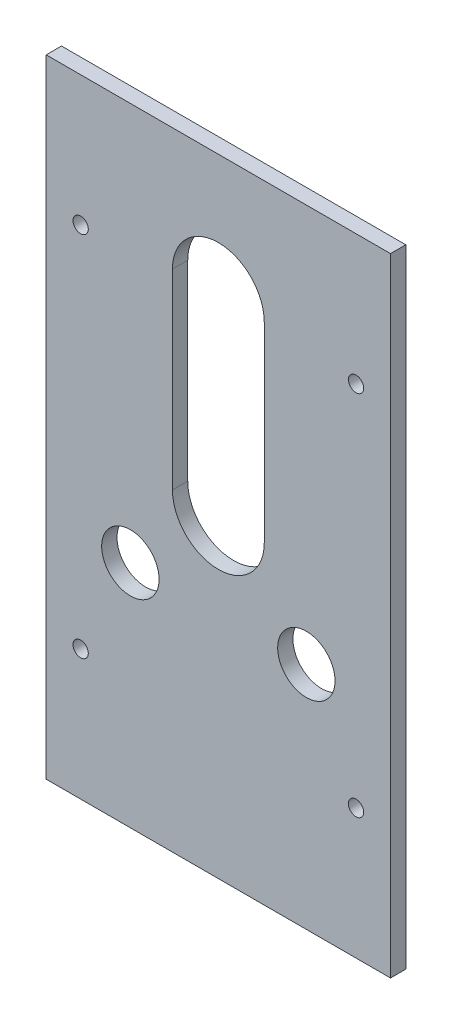
ISO-10303-21;
HEADER;
FILE_DESCRIPTION(('STEP AP214'),'2;1');
FILE_NAME('part.step','',(''),(''),'','','');
FILE_SCHEMA(('AUTOMOTIVE_DESIGN { 1 0 10303 214 1 1 1 1 }'));
ENDSEC;
DATA;
#1=APPLICATION_CONTEXT('core data for automotive mechanical design processes');
#2=APPLICATION_PROTOCOL_DEFINITION('international standard','automotive_design',2000,#1);
#3=PRODUCT_CONTEXT('',#1,'mechanical');
#4=PRODUCT('Part','Part','',(#3));
#5=PRODUCT_RELATED_PRODUCT_CATEGORY('part','',(#4));
#6=PRODUCT_DEFINITION_FORMATION('','',#4);
#7=PRODUCT_DEFINITION_CONTEXT('part definition',#1,'design');
#8=PRODUCT_DEFINITION('design','',#6,#7);
#9=PRODUCT_DEFINITION_SHAPE('','',#8);
#10=(LENGTH_UNIT() NAMED_UNIT(*) SI_UNIT(.MILLI.,.METRE.));
#11=(NAMED_UNIT(*) PLANE_ANGLE_UNIT() SI_UNIT($,.RADIAN.));
#12=(NAMED_UNIT(*) SI_UNIT($,.STERADIAN.) SOLID_ANGLE_UNIT());
#13=UNCERTAINTY_MEASURE_WITH_UNIT(LENGTH_MEASURE(1.E-05),#10,'distance_accuracy_value','');
#14=(GEOMETRIC_REPRESENTATION_CONTEXT(3) GLOBAL_UNCERTAINTY_ASSIGNED_CONTEXT((#13)) GLOBAL_UNIT_ASSIGNED_CONTEXT((#10,
#11,#12)) REPRESENTATION_CONTEXT('',''));
#15=CARTESIAN_POINT('',(0.,0.,0.));
#16=DIRECTION('',(0.,0.,1.));
#17=DIRECTION('',(1.,0.,0.));
#18=AXIS2_PLACEMENT_3D('',#15,#16,#17);
#19=CARTESIAN_POINT('',(0.,0.,4.));
#20=DIRECTION('',(0.,0.,-1.));
#21=DIRECTION('',(-1.,0.,0.));
#22=AXIS2_PLACEMENT_3D('',#19,#20,#21);
#23=PLANE('',#22);
#24=CARTESIAN_POINT('',(36.,48.,4.));
#25=DIRECTION('',(0.,0.,1.));
#26=DIRECTION('',(-1.,0.,0.));
#27=AXIS2_PLACEMENT_3D('',#24,#25,#26);
#28=CIRCLE('',#27,2.);
#29=CARTESIAN_POINT('',(34.,48.,4.));
#30=VERTEX_POINT('',#29);
#31=EDGE_CURVE('E139',#30,#30,#28,.T.);
#32=ORIENTED_EDGE('',*,*,#31,.F.);
#33=EDGE_LOOP('',(#32));
#34=FACE_BOUND('',#33,.T.);
#35=CARTESIAN_POINT('',(36.,-48.,4.));
#36=DIRECTION('',(0.,0.,1.));
#37=DIRECTION('',(-1.,0.,0.));
#38=AXIS2_PLACEMENT_3D('',#35,#36,#37);
#39=CIRCLE('',#38,2.);
#40=CARTESIAN_POINT('',(34.,-48.,4.));
#41=VERTEX_POINT('',#40);
#42=EDGE_CURVE('E145',#41,#41,#39,.T.);
#43=ORIENTED_EDGE('',*,*,#42,.F.);
#44=EDGE_LOOP('',(#43));
#45=FACE_BOUND('',#44,.T.);
#46=CARTESIAN_POINT('',(-36.,-48.,4.));
#47=DIRECTION('',(0.,0.,1.));
#48=DIRECTION('',(1.,0.,0.));
#49=AXIS2_PLACEMENT_3D('',#46,#47,#48);
#50=CIRCLE('',#49,2.);
#51=CARTESIAN_POINT('',(-34.,-48.,4.));
#52=VERTEX_POINT('',#51);
#53=EDGE_CURVE('E151',#52,#52,#50,.T.);
#54=ORIENTED_EDGE('',*,*,#53,.F.);
#55=EDGE_LOOP('',(#54));
#56=FACE_BOUND('',#55,.T.);
#57=CARTESIAN_POINT('',(-36.,48.,4.));
#58=DIRECTION('',(0.,0.,1.));
#59=DIRECTION('',(1.,0.,0.));
#60=AXIS2_PLACEMENT_3D('',#57,#58,#59);
#61=CIRCLE('',#60,2.);
#62=CARTESIAN_POINT('',(-34.,48.,4.));
#63=VERTEX_POINT('',#62);
#64=EDGE_CURVE('E157',#63,#63,#61,.T.);
#65=ORIENTED_EDGE('',*,*,#64,.F.);
#66=EDGE_LOOP('',(#65));
#67=FACE_BOUND('',#66,.T.);
#68=DIRECTION('',(0.,1.,0.));
#69=VECTOR('',#68,1.);
#70=CARTESIAN_POINT('',(45.,-82.,4.));
#71=LINE('',#70,#69);
#72=CARTESIAN_POINT('',(45.,-82.,4.));
#73=VERTEX_POINT('',#72);
#74=CARTESIAN_POINT('',(45.,82.,4.));
#75=VERTEX_POINT('',#74);
#76=EDGE_CURVE('E163',#73,#75,#71,.T.);
#77=ORIENTED_EDGE('',*,*,#76,.T.);
#78=DIRECTION('',(-1.,0.,0.));
#79=VECTOR('',#78,1.);
#80=CARTESIAN_POINT('',(-45.,82.,4.));
#81=LINE('',#80,#79);
#82=CARTESIAN_POINT('',(-45.,82.,4.));
#83=VERTEX_POINT('',#82);
#84=EDGE_CURVE('E166',#75,#83,#81,.T.);
#85=ORIENTED_EDGE('',*,*,#84,.T.);
#86=DIRECTION('',(0.,-1.,0.));
#87=VECTOR('',#86,1.);
#88=CARTESIAN_POINT('',(-45.,-82.,4.));
#89=LINE('',#88,#87);
#90=CARTESIAN_POINT('',(-45.,-82.,4.));
#91=VERTEX_POINT('',#90);
#92=EDGE_CURVE('E169',#83,#91,#89,.T.);
#93=ORIENTED_EDGE('',*,*,#92,.T.);
#94=DIRECTION('',(1.,0.,0.));
#95=VECTOR('',#94,1.);
#96=CARTESIAN_POINT('',(-45.,-82.,4.));
#97=LINE('',#96,#95);
#98=EDGE_CURVE('E171',#91,#73,#97,.T.);
#99=ORIENTED_EDGE('',*,*,#98,.T.);
#100=EDGE_LOOP('',(#77,#85,#93,#99));
#101=FACE_BOUND('',#100,.T.);
#102=CARTESIAN_POINT('',(0.,0.,4.));
#103=DIRECTION('',(0.,0.,1.));
#104=DIRECTION('',(1.,0.,0.));
#105=AXIS2_PLACEMENT_3D('',#102,#103,#104);
#106=CIRCLE('',#105,12.);
#107=CARTESIAN_POINT('',(-12.,0.,4.));
#108=VERTEX_POINT('',#107);
#109=CARTESIAN_POINT('',(12.,0.,4.));
#110=VERTEX_POINT('',#109);
#111=EDGE_CURVE('E100',#108,#110,#106,.T.);
#112=ORIENTED_EDGE('',*,*,#111,.F.);
#113=DIRECTION('',(0.,-1.,0.));
#114=VECTOR('',#113,1.);
#115=CARTESIAN_POINT('',(-12.,0.,4.));
#116=LINE('',#115,#114);
#117=CARTESIAN_POINT('',(-12.,50.,4.));
#118=VERTEX_POINT('',#117);
#119=EDGE_CURVE('E123',#118,#108,#116,.T.);
#120=ORIENTED_EDGE('',*,*,#119,.F.);
#121=CARTESIAN_POINT('',(0.,50.,4.));
#122=DIRECTION('',(0.,0.,1.));
#123=DIRECTION('',(1.,0.,0.));
#124=AXIS2_PLACEMENT_3D('',#121,#122,#123);
#125=CIRCLE('',#124,12.);
#126=CARTESIAN_POINT('',(12.,50.,4.));
#127=VERTEX_POINT('',#126);
#128=EDGE_CURVE('E121',#127,#118,#125,.T.);
#129=ORIENTED_EDGE('',*,*,#128,.F.);
#130=DIRECTION('',(0.,1.,0.));
#131=VECTOR('',#130,1.);
#132=CARTESIAN_POINT('',(12.,0.,4.));
#133=LINE('',#132,#131);
#134=EDGE_CURVE('E108',#110,#127,#133,.T.);
#135=ORIENTED_EDGE('',*,*,#134,.F.);
#136=EDGE_LOOP('',(#112,#120,#129,#135));
#137=FACE_BOUND('',#136,.T.);
#138=CARTESIAN_POINT('',(-23.,-22.,4.));
#139=DIRECTION('',(0.,0.,1.));
#140=DIRECTION('',(1.,0.,0.));
#141=AXIS2_PLACEMENT_3D('',#138,#139,#140);
#142=CIRCLE('',#141,7.5);
#143=CARTESIAN_POINT('',(-15.5,-22.,4.));
#144=VERTEX_POINT('',#143);
#145=EDGE_CURVE('E129',#144,#144,#142,.T.);
#146=ORIENTED_EDGE('',*,*,#145,.F.);
#147=EDGE_LOOP('',(#146));
#148=FACE_BOUND('',#147,.T.);
#149=CARTESIAN_POINT('',(23.,-22.,4.));
#150=DIRECTION('',(0.,0.,1.));
#151=DIRECTION('',(-1.,0.,0.));
#152=AXIS2_PLACEMENT_3D('',#149,#150,#151);
#153=CIRCLE('',#152,7.5);
#154=CARTESIAN_POINT('',(15.5,-22.,4.));
#155=VERTEX_POINT('',#154);
#156=EDGE_CURVE('E277',#155,#155,#153,.T.);
#157=ORIENTED_EDGE('',*,*,#156,.F.);
#158=EDGE_LOOP('',(#157));
#159=FACE_BOUND('',#158,.T.);
#160=ADVANCED_FACE('F35',(#34,#45,#56,#67,#101,#137,#148,#159),#23,.F.);
#161=CARTESIAN_POINT('',(0.,0.,0.));
#162=DIRECTION('',(0.,0.,-1.));
#163=DIRECTION('',(-1.,0.,0.));
#164=AXIS2_PLACEMENT_3D('',#161,#162,#163);
#165=PLANE('',#164);
#166=CARTESIAN_POINT('',(-23.,-22.,0.));
#167=DIRECTION('',(0.,0.,1.));
#168=DIRECTION('',(1.,0.,0.));
#169=AXIS2_PLACEMENT_3D('',#166,#167,#168);
#170=CIRCLE('',#169,7.5);
#171=CARTESIAN_POINT('',(-15.5,-22.,0.));
#172=VERTEX_POINT('',#171);
#173=EDGE_CURVE('E283',#172,#172,#170,.T.);
#174=ORIENTED_EDGE('',*,*,#173,.T.);
#175=EDGE_LOOP('',(#174));
#176=FACE_BOUND('',#175,.T.);
#177=CARTESIAN_POINT('',(36.,-48.,0.));
#178=DIRECTION('',(0.,0.,1.));
#179=DIRECTION('',(-1.,0.,0.));
#180=AXIS2_PLACEMENT_3D('',#177,#178,#179);
#181=CIRCLE('',#180,2.);
#182=CARTESIAN_POINT('',(34.,-48.,0.));
#183=VERTEX_POINT('',#182);
#184=EDGE_CURVE('E142',#183,#183,#181,.T.);
#185=ORIENTED_EDGE('',*,*,#184,.T.);
#186=EDGE_LOOP('',(#185));
#187=FACE_BOUND('',#186,.T.);
#188=CARTESIAN_POINT('',(-36.,48.,0.));
#189=DIRECTION('',(0.,0.,1.));
#190=DIRECTION('',(1.,0.,0.));
#191=AXIS2_PLACEMENT_3D('',#188,#189,#190);
#192=CIRCLE('',#191,2.);
#193=CARTESIAN_POINT('',(-34.,48.,0.));
#194=VERTEX_POINT('',#193);
#195=EDGE_CURVE('E154',#194,#194,#192,.T.);
#196=ORIENTED_EDGE('',*,*,#195,.T.);
#197=EDGE_LOOP('',(#196));
#198=FACE_BOUND('',#197,.T.);
#199=DIRECTION('',(0.,1.,0.));
#200=VECTOR('',#199,1.);
#201=CARTESIAN_POINT('',(45.,-82.,0.));
#202=LINE('',#201,#200);
#203=CARTESIAN_POINT('',(45.,-82.,0.));
#204=VERTEX_POINT('',#203);
#205=CARTESIAN_POINT('',(45.,82.,0.));
#206=VERTEX_POINT('',#205);
#207=EDGE_CURVE('E160',#204,#206,#202,.T.);
#208=ORIENTED_EDGE('',*,*,#207,.F.);
#209=DIRECTION('',(1.,0.,0.));
#210=VECTOR('',#209,1.);
#211=CARTESIAN_POINT('',(-45.,-82.,0.));
#212=LINE('',#211,#210);
#213=CARTESIAN_POINT('',(-45.,-82.,0.));
#214=VERTEX_POINT('',#213);
#215=EDGE_CURVE('E167',#214,#204,#212,.T.);
#216=ORIENTED_EDGE('',*,*,#215,.F.);
#217=DIRECTION('',(0.,-1.,0.));
#218=VECTOR('',#217,1.);
#219=CARTESIAN_POINT('',(-45.,-82.,0.));
#220=LINE('',#219,#218);
#221=CARTESIAN_POINT('',(-45.,82.,0.));
#222=VERTEX_POINT('',#221);
#223=EDGE_CURVE('E178',#222,#214,#220,.T.);
#224=ORIENTED_EDGE('',*,*,#223,.F.);
#225=DIRECTION('',(-1.,0.,0.));
#226=VECTOR('',#225,1.);
#227=CARTESIAN_POINT('',(-45.,82.,0.));
#228=LINE('',#227,#226);
#229=EDGE_CURVE('E176',#206,#222,#228,.T.);
#230=ORIENTED_EDGE('',*,*,#229,.F.);
#231=EDGE_LOOP('',(#208,#216,#224,#230));
#232=FACE_BOUND('',#231,.T.);
#233=CARTESIAN_POINT('',(-36.,-48.,0.));
#234=DIRECTION('',(0.,0.,1.));
#235=DIRECTION('',(1.,0.,0.));
#236=AXIS2_PLACEMENT_3D('',#233,#234,#235);
#237=CIRCLE('',#236,2.);
#238=CARTESIAN_POINT('',(-34.,-48.,0.));
#239=VERTEX_POINT('',#238);
#240=EDGE_CURVE('E148',#239,#239,#237,.T.);
#241=ORIENTED_EDGE('',*,*,#240,.T.);
#242=EDGE_LOOP('',(#241));
#243=FACE_BOUND('',#242,.T.);
#244=CARTESIAN_POINT('',(36.,48.,0.));
#245=DIRECTION('',(0.,0.,1.));
#246=DIRECTION('',(-1.,0.,0.));
#247=AXIS2_PLACEMENT_3D('',#244,#245,#246);
#248=CIRCLE('',#247,2.);
#249=CARTESIAN_POINT('',(34.,48.,0.));
#250=VERTEX_POINT('',#249);
#251=EDGE_CURVE('E116',#250,#250,#248,.T.);
#252=ORIENTED_EDGE('',*,*,#251,.T.);
#253=EDGE_LOOP('',(#252));
#254=FACE_BOUND('',#253,.T.);
#255=DIRECTION('',(0.,-1.,0.));
#256=VECTOR('',#255,1.);
#257=CARTESIAN_POINT('',(-12.,0.,0.));
#258=LINE('',#257,#256);
#259=CARTESIAN_POINT('',(-12.,50.,0.));
#260=VERTEX_POINT('',#259);
#261=CARTESIAN_POINT('',(-12.,0.,0.));
#262=VERTEX_POINT('',#261);
#263=EDGE_CURVE('E109',#260,#262,#258,.T.);
#264=ORIENTED_EDGE('',*,*,#263,.T.);
#265=CARTESIAN_POINT('',(0.,0.,0.));
#266=DIRECTION('',(0.,0.,1.));
#267=DIRECTION('',(1.,0.,0.));
#268=AXIS2_PLACEMENT_3D('',#265,#266,#267);
#269=CIRCLE('',#268,12.);
#270=CARTESIAN_POINT('',(12.,0.,0.));
#271=VERTEX_POINT('',#270);
#272=EDGE_CURVE('E58',#262,#271,#269,.T.);
#273=ORIENTED_EDGE('',*,*,#272,.T.);
#274=DIRECTION('',(0.,1.,0.));
#275=VECTOR('',#274,1.);
#276=CARTESIAN_POINT('',(12.,0.,0.));
#277=LINE('',#276,#275);
#278=CARTESIAN_POINT('',(12.,50.,0.));
#279=VERTEX_POINT('',#278);
#280=EDGE_CURVE('E115',#271,#279,#277,.T.);
#281=ORIENTED_EDGE('',*,*,#280,.T.);
#282=CARTESIAN_POINT('',(0.,50.,0.));
#283=DIRECTION('',(0.,0.,1.));
#284=DIRECTION('',(1.,0.,0.));
#285=AXIS2_PLACEMENT_3D('',#282,#283,#284);
#286=CIRCLE('',#285,12.);
#287=EDGE_CURVE('E131',#279,#260,#286,.T.);
#288=ORIENTED_EDGE('',*,*,#287,.T.);
#289=EDGE_LOOP('',(#264,#273,#281,#288));
#290=FACE_BOUND('',#289,.T.);
#291=CARTESIAN_POINT('',(23.,-22.,0.));
#292=DIRECTION('',(0.,0.,1.));
#293=DIRECTION('',(-1.,0.,0.));
#294=AXIS2_PLACEMENT_3D('',#291,#292,#293);
#295=CIRCLE('',#294,7.5);
#296=CARTESIAN_POINT('',(15.5,-22.,0.));
#297=VERTEX_POINT('',#296);
#298=EDGE_CURVE('E280',#297,#297,#295,.T.);
#299=ORIENTED_EDGE('',*,*,#298,.T.);
#300=EDGE_LOOP('',(#299));
#301=FACE_BOUND('',#300,.T.);
#302=ADVANCED_FACE('F196',(#176,#187,#198,#232,#243,#254,#290,#301),#165,.T.);
#303=CARTESIAN_POINT('',(45.,-82.,4.));
#304=DIRECTION('',(-1.,0.,0.));
#305=DIRECTION('',(0.,0.,1.));
#306=AXIS2_PLACEMENT_3D('',#303,#304,#305);
#307=PLANE('',#306);
#308=ORIENTED_EDGE('',*,*,#207,.T.);
#309=DIRECTION('',(0.,0.,-1.));
#310=VECTOR('',#309,1.);
#311=CARTESIAN_POINT('',(45.,82.,4.));
#312=LINE('',#311,#310);
#313=EDGE_CURVE('E11',#75,#206,#312,.T.);
#314=ORIENTED_EDGE('',*,*,#313,.F.);
#315=ORIENTED_EDGE('',*,*,#76,.F.);
#316=DIRECTION('',(0.,0.,-1.));
#317=VECTOR('',#316,1.);
#318=CARTESIAN_POINT('',(45.,-82.,4.));
#319=LINE('',#318,#317);
#320=EDGE_CURVE('E173',#73,#204,#319,.T.);
#321=ORIENTED_EDGE('',*,*,#320,.T.);
#322=EDGE_LOOP('',(#308,#314,#315,#321));
#323=FACE_BOUND('',#322,.T.);
#324=ADVANCED_FACE('F37',(#323),#307,.F.);
#325=CARTESIAN_POINT('',(-45.,82.,4.));
#326=DIRECTION('',(0.,-1.,0.));
#327=DIRECTION('',(0.,0.,-1.));
#328=AXIS2_PLACEMENT_3D('',#325,#326,#327);
#329=PLANE('',#328);
#330=ORIENTED_EDGE('',*,*,#229,.T.);
#331=DIRECTION('',(0.,0.,-1.));
#332=VECTOR('',#331,1.);
#333=CARTESIAN_POINT('',(-45.,82.,4.));
#334=LINE('',#333,#332);
#335=EDGE_CURVE('E43',#83,#222,#334,.T.);
#336=ORIENTED_EDGE('',*,*,#335,.F.);
#337=ORIENTED_EDGE('',*,*,#84,.F.);
#338=ORIENTED_EDGE('',*,*,#313,.T.);
#339=EDGE_LOOP('',(#330,#336,#337,#338));
#340=FACE_BOUND('',#339,.T.);
#341=ADVANCED_FACE('F206',(#340),#329,.F.);
#342=CARTESIAN_POINT('',(-45.,-82.,4.));
#343=DIRECTION('',(1.,0.,0.));
#344=DIRECTION('',(0.,1.,0.));
#345=AXIS2_PLACEMENT_3D('',#342,#343,#344);
#346=PLANE('',#345);
#347=ORIENTED_EDGE('',*,*,#223,.T.);
#348=DIRECTION('',(0.,0.,-1.));
#349=VECTOR('',#348,1.);
#350=CARTESIAN_POINT('',(-45.,-82.,4.));
#351=LINE('',#350,#349);
#352=EDGE_CURVE('E183',#91,#214,#351,.T.);
#353=ORIENTED_EDGE('',*,*,#352,.F.);
#354=ORIENTED_EDGE('',*,*,#92,.F.);
#355=ORIENTED_EDGE('',*,*,#335,.T.);
#356=EDGE_LOOP('',(#347,#353,#354,#355));
#357=FACE_BOUND('',#356,.T.);
#358=ADVANCED_FACE('F190',(#357),#346,.F.);
#359=CARTESIAN_POINT('',(-45.,-82.,4.));
#360=DIRECTION('',(0.,1.,0.));
#361=DIRECTION('',(0.,0.,1.));
#362=AXIS2_PLACEMENT_3D('',#359,#360,#361);
#363=PLANE('',#362);
#364=ORIENTED_EDGE('',*,*,#215,.T.);
#365=ORIENTED_EDGE('',*,*,#320,.F.);
#366=ORIENTED_EDGE('',*,*,#98,.F.);
#367=ORIENTED_EDGE('',*,*,#352,.T.);
#368=EDGE_LOOP('',(#364,#365,#366,#367));
#369=FACE_BOUND('',#368,.T.);
#370=ADVANCED_FACE('F200',(#369),#363,.F.);
#371=CARTESIAN_POINT('',(-36.,48.,4.));
#372=DIRECTION('',(0.,0.,-1.));
#373=DIRECTION('',(-1.,0.,0.));
#374=AXIS2_PLACEMENT_3D('',#371,#372,#373);
#375=CYLINDRICAL_SURFACE('',#374,2.);
#376=ORIENTED_EDGE('',*,*,#64,.T.);
#377=EDGE_LOOP('',(#376));
#378=FACE_BOUND('',#377,.T.);
#379=ORIENTED_EDGE('',*,*,#195,.F.);
#380=EDGE_LOOP('',(#379));
#381=FACE_BOUND('',#380,.T.);
#382=ADVANCED_FACE('F224',(#378,#381),#375,.F.);
#383=CARTESIAN_POINT('',(-36.,-48.,4.));
#384=DIRECTION('',(0.,0.,-1.));
#385=DIRECTION('',(-1.,0.,0.));
#386=AXIS2_PLACEMENT_3D('',#383,#384,#385);
#387=CYLINDRICAL_SURFACE('',#386,2.);
#388=ORIENTED_EDGE('',*,*,#53,.T.);
#389=EDGE_LOOP('',(#388));
#390=FACE_BOUND('',#389,.T.);
#391=ORIENTED_EDGE('',*,*,#240,.F.);
#392=EDGE_LOOP('',(#391));
#393=FACE_BOUND('',#392,.T.);
#394=ADVANCED_FACE('F231',(#390,#393),#387,.F.);
#395=CARTESIAN_POINT('',(36.,-48.,4.));
#396=DIRECTION('',(0.,0.,-1.));
#397=DIRECTION('',(-1.,0.,0.));
#398=AXIS2_PLACEMENT_3D('',#395,#396,#397);
#399=CYLINDRICAL_SURFACE('',#398,2.);
#400=ORIENTED_EDGE('',*,*,#42,.T.);
#401=EDGE_LOOP('',(#400));
#402=FACE_BOUND('',#401,.T.);
#403=ORIENTED_EDGE('',*,*,#184,.F.);
#404=EDGE_LOOP('',(#403));
#405=FACE_BOUND('',#404,.T.);
#406=ADVANCED_FACE('F236',(#402,#405),#399,.F.);
#407=CARTESIAN_POINT('',(36.,48.,4.));
#408=DIRECTION('',(0.,0.,-1.));
#409=DIRECTION('',(-1.,0.,0.));
#410=AXIS2_PLACEMENT_3D('',#407,#408,#409);
#411=CYLINDRICAL_SURFACE('',#410,2.);
#412=ORIENTED_EDGE('',*,*,#31,.T.);
#413=EDGE_LOOP('',(#412));
#414=FACE_BOUND('',#413,.T.);
#415=ORIENTED_EDGE('',*,*,#251,.F.);
#416=EDGE_LOOP('',(#415));
#417=FACE_BOUND('',#416,.T.);
#418=ADVANCED_FACE('F246',(#414,#417),#411,.F.);
#419=CARTESIAN_POINT('',(0.,0.,4.));
#420=DIRECTION('',(0.,0.,-1.));
#421=DIRECTION('',(-1.,0.,0.));
#422=AXIS2_PLACEMENT_3D('',#419,#420,#421);
#423=CYLINDRICAL_SURFACE('',#422,12.);
#424=ORIENTED_EDGE('',*,*,#272,.F.);
#425=DIRECTION('',(0.,0.,-1.));
#426=VECTOR('',#425,1.);
#427=CARTESIAN_POINT('',(-12.,0.,4.));
#428=LINE('',#427,#426);
#429=EDGE_CURVE('E104',#108,#262,#428,.T.);
#430=ORIENTED_EDGE('',*,*,#429,.F.);
#431=ORIENTED_EDGE('',*,*,#111,.T.);
#432=DIRECTION('',(0.,0.,-1.));
#433=VECTOR('',#432,1.);
#434=CARTESIAN_POINT('',(12.,0.,4.));
#435=LINE('',#434,#433);
#436=EDGE_CURVE('E103',#110,#271,#435,.T.);
#437=ORIENTED_EDGE('',*,*,#436,.T.);
#438=EDGE_LOOP('',(#424,#430,#431,#437));
#439=FACE_BOUND('',#438,.T.);
#440=ADVANCED_FACE('F102',(#439),#423,.F.);
#441=CARTESIAN_POINT('',(12.,0.,4.));
#442=DIRECTION('',(-1.,0.,0.));
#443=DIRECTION('',(0.,-1.,0.));
#444=AXIS2_PLACEMENT_3D('',#441,#442,#443);
#445=PLANE('',#444);
#446=ORIENTED_EDGE('',*,*,#280,.F.);
#447=ORIENTED_EDGE('',*,*,#436,.F.);
#448=ORIENTED_EDGE('',*,*,#134,.T.);
#449=DIRECTION('',(0.,0.,-1.));
#450=VECTOR('',#449,1.);
#451=CARTESIAN_POINT('',(12.,50.,4.));
#452=LINE('',#451,#450);
#453=EDGE_CURVE('E117',#127,#279,#452,.T.);
#454=ORIENTED_EDGE('',*,*,#453,.T.);
#455=EDGE_LOOP('',(#446,#447,#448,#454));
#456=FACE_BOUND('',#455,.T.);
#457=ADVANCED_FACE('F112',(#456),#445,.T.);
#458=CARTESIAN_POINT('',(0.,50.,4.));
#459=DIRECTION('',(0.,0.,-1.));
#460=DIRECTION('',(-1.,0.,0.));
#461=AXIS2_PLACEMENT_3D('',#458,#459,#460);
#462=CYLINDRICAL_SURFACE('',#461,12.);
#463=ORIENTED_EDGE('',*,*,#287,.F.);
#464=ORIENTED_EDGE('',*,*,#453,.F.);
#465=ORIENTED_EDGE('',*,*,#128,.T.);
#466=DIRECTION('',(0.,0.,-1.));
#467=VECTOR('',#466,1.);
#468=CARTESIAN_POINT('',(-12.,50.,4.));
#469=LINE('',#468,#467);
#470=EDGE_CURVE('E50',#118,#260,#469,.T.);
#471=ORIENTED_EDGE('',*,*,#470,.T.);
#472=EDGE_LOOP('',(#463,#464,#465,#471));
#473=FACE_BOUND('',#472,.T.);
#474=ADVANCED_FACE('F258',(#473),#462,.F.);
#475=CARTESIAN_POINT('',(-12.,0.,4.));
#476=DIRECTION('',(1.,0.,0.));
#477=DIRECTION('',(0.,1.,0.));
#478=AXIS2_PLACEMENT_3D('',#475,#476,#477);
#479=PLANE('',#478);
#480=ORIENTED_EDGE('',*,*,#263,.F.);
#481=ORIENTED_EDGE('',*,*,#470,.F.);
#482=ORIENTED_EDGE('',*,*,#119,.T.);
#483=ORIENTED_EDGE('',*,*,#429,.T.);
#484=EDGE_LOOP('',(#480,#481,#482,#483));
#485=FACE_BOUND('',#484,.T.);
#486=ADVANCED_FACE('F261',(#485),#479,.T.);
#487=CARTESIAN_POINT('',(-23.,-22.,4.));
#488=DIRECTION('',(0.,0.,-1.));
#489=DIRECTION('',(-1.,0.,0.));
#490=AXIS2_PLACEMENT_3D('',#487,#488,#489);
#491=CYLINDRICAL_SURFACE('',#490,7.5);
#492=ORIENTED_EDGE('',*,*,#145,.T.);
#493=EDGE_LOOP('',(#492));
#494=FACE_BOUND('',#493,.T.);
#495=ORIENTED_EDGE('',*,*,#173,.F.);
#496=EDGE_LOOP('',(#495));
#497=FACE_BOUND('',#496,.T.);
#498=ADVANCED_FACE('F265',(#494,#497),#491,.F.);
#499=CARTESIAN_POINT('',(23.,-22.,4.));
#500=DIRECTION('',(0.,0.,-1.));
#501=DIRECTION('',(-1.,0.,0.));
#502=AXIS2_PLACEMENT_3D('',#499,#500,#501);
#503=CYLINDRICAL_SURFACE('',#502,7.5);
#504=ORIENTED_EDGE('',*,*,#156,.T.);
#505=EDGE_LOOP('',(#504));
#506=FACE_BOUND('',#505,.T.);
#507=ORIENTED_EDGE('',*,*,#298,.F.);
#508=EDGE_LOOP('',(#507));
#509=FACE_BOUND('',#508,.T.);
#510=ADVANCED_FACE('F268',(#506,#509),#503,.F.);
#511=CLOSED_SHELL('',(#160,#302,#324,#341,#358,#370,#382,#394,#406,#418,#440,#457,#474,#486,
#498,#510));
#512=MANIFOLD_SOLID_BREP('B2',#511);
#513=ADVANCED_BREP_SHAPE_REPRESENTATION('',(#18,#512),#14);
#514=SHAPE_DEFINITION_REPRESENTATION(#9,#513);
ENDSEC;
END-ISO-10303-21;
